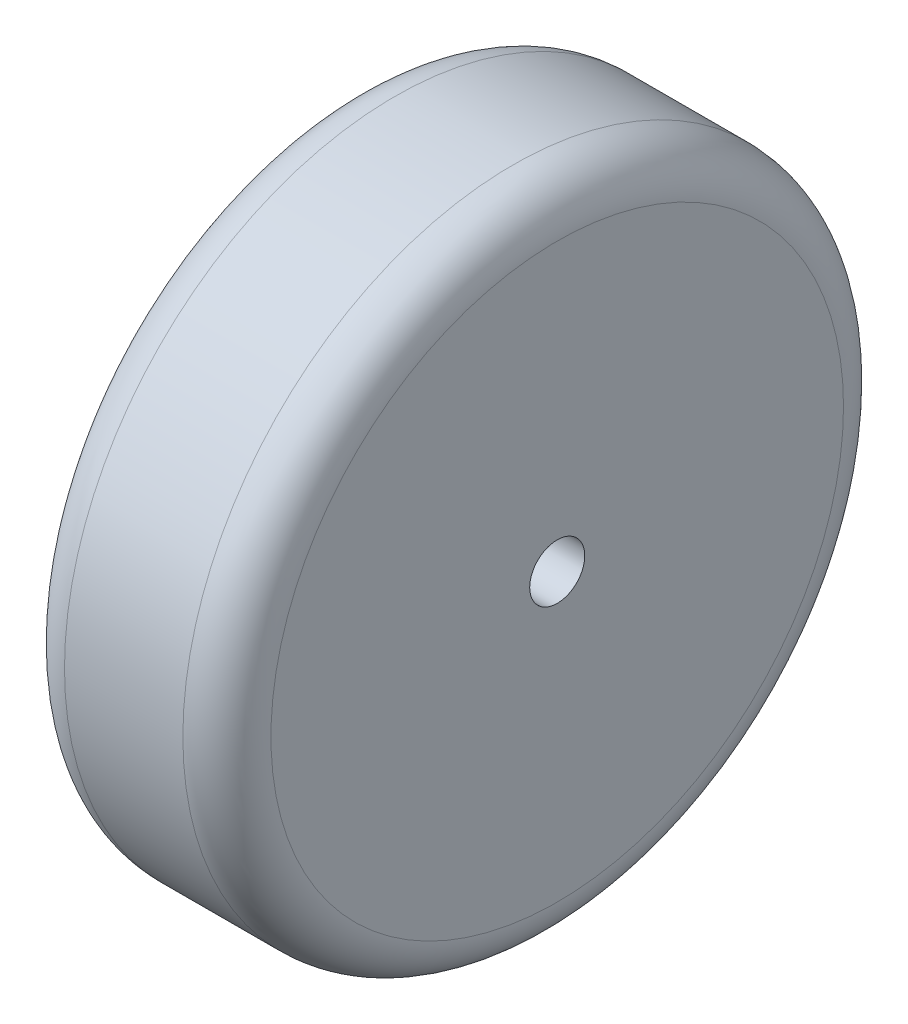
ISO-10303-21;
HEADER;
FILE_DESCRIPTION(('STEP AP214'),'2;1');
FILE_NAME('part.step','',(''),(''),'','','');
FILE_SCHEMA(('AUTOMOTIVE_DESIGN { 1 0 10303 214 1 1 1 1 }'));
ENDSEC;
DATA;
#1=APPLICATION_CONTEXT('core data for automotive mechanical design processes');
#2=APPLICATION_PROTOCOL_DEFINITION('international standard','automotive_design',2000,#1);
#3=PRODUCT_CONTEXT('',#1,'mechanical');
#4=PRODUCT('Part','Part','',(#3));
#5=PRODUCT_RELATED_PRODUCT_CATEGORY('part','',(#4));
#6=PRODUCT_DEFINITION_FORMATION('','',#4);
#7=PRODUCT_DEFINITION_CONTEXT('part definition',#1,'design');
#8=PRODUCT_DEFINITION('design','',#6,#7);
#9=PRODUCT_DEFINITION_SHAPE('','',#8);
#10=(LENGTH_UNIT() NAMED_UNIT(*) SI_UNIT(.MILLI.,.METRE.));
#11=(NAMED_UNIT(*) PLANE_ANGLE_UNIT() SI_UNIT($,.RADIAN.));
#12=(NAMED_UNIT(*) SI_UNIT($,.STERADIAN.) SOLID_ANGLE_UNIT());
#13=UNCERTAINTY_MEASURE_WITH_UNIT(LENGTH_MEASURE(1.E-05),#10,'distance_accuracy_value','');
#14=(GEOMETRIC_REPRESENTATION_CONTEXT(3) GLOBAL_UNCERTAINTY_ASSIGNED_CONTEXT((#13)) GLOBAL_UNIT_ASSIGNED_CONTEXT((#10,
#11,#12)) REPRESENTATION_CONTEXT('',''));
#15=CARTESIAN_POINT('',(0.,0.,0.));
#16=DIRECTION('',(0.,0.,1.));
#17=DIRECTION('',(1.,0.,0.));
#18=AXIS2_PLACEMENT_3D('',#15,#16,#17);
#19=CARTESIAN_POINT('',(11.90625,0.,3.175));
#20=DIRECTION('',(1.,0.,0.));
#21=DIRECTION('',(0.,0.,-1.));
#22=AXIS2_PLACEMENT_3D('',#19,#20,#21);
#23=PLANE('',#22);
#24=CARTESIAN_POINT('',(11.90625,0.,0.));
#25=DIRECTION('',(1.,0.,0.));
#26=DIRECTION('',(0.,0.,-1.));
#27=AXIS2_PLACEMENT_3D('',#24,#25,#26);
#28=CIRCLE('',#27,33.02);
#29=CARTESIAN_POINT('',(11.90625,0.,-33.02));
#30=VERTEX_POINT('',#29);
#31=EDGE_CURVE('E10',#30,#30,#28,.T.);
#32=ORIENTED_EDGE('',*,*,#31,.T.);
#33=EDGE_LOOP('',(#32));
#34=FACE_BOUND('',#33,.T.);
#35=CARTESIAN_POINT('',(11.90625,0.,0.));
#36=DIRECTION('',(-1.,0.,0.));
#37=DIRECTION('',(0.,0.,1.));
#38=AXIS2_PLACEMENT_3D('',#35,#36,#37);
#39=CIRCLE('',#38,3.175);
#40=CARTESIAN_POINT('',(11.90625,0.,3.175));
#41=VERTEX_POINT('',#40);
#42=EDGE_CURVE('E67',#41,#41,#39,.T.);
#43=ORIENTED_EDGE('',*,*,#42,.T.);
#44=EDGE_LOOP('',(#43));
#45=FACE_BOUND('',#44,.T.);
#46=ADVANCED_FACE('F39',(#34,#45),#23,.T.);
#47=CARTESIAN_POINT('',(-11.90625,0.,0.));
#48=DIRECTION('',(-1.,0.,0.));
#49=DIRECTION('',(0.,0.,1.));
#50=AXIS2_PLACEMENT_3D('',#47,#48,#49);
#51=CYLINDRICAL_SURFACE('',#50,38.1);
#52=CARTESIAN_POINT('',(-6.82625,0.,0.));
#53=DIRECTION('',(-1.,0.,0.));
#54=DIRECTION('',(0.,0.,1.));
#55=AXIS2_PLACEMENT_3D('',#52,#53,#54);
#56=CIRCLE('',#55,38.1);
#57=CARTESIAN_POINT('',(-6.82625,0.,38.1));
#58=VERTEX_POINT('',#57);
#59=EDGE_CURVE('E47',#58,#58,#56,.F.);
#60=ORIENTED_EDGE('',*,*,#59,.T.);
#61=EDGE_LOOP('',(#60));
#62=FACE_BOUND('',#61,.T.);
#63=CARTESIAN_POINT('',(6.82625,0.,0.));
#64=DIRECTION('',(1.,0.,0.));
#65=DIRECTION('',(0.,0.,-1.));
#66=AXIS2_PLACEMENT_3D('',#63,#64,#65);
#67=CIRCLE('',#66,38.1);
#68=CARTESIAN_POINT('',(6.82625,0.,-38.1));
#69=VERTEX_POINT('',#68);
#70=EDGE_CURVE('E52',#69,#69,#67,.F.);
#71=ORIENTED_EDGE('',*,*,#70,.T.);
#72=EDGE_LOOP('',(#71));
#73=FACE_BOUND('',#72,.T.);
#74=ADVANCED_FACE('F84',(#62,#73),#51,.T.);
#75=CARTESIAN_POINT('',(-11.90625,0.,38.1));
#76=DIRECTION('',(-1.,0.,0.));
#77=DIRECTION('',(0.,0.,1.));
#78=AXIS2_PLACEMENT_3D('',#75,#76,#77);
#79=PLANE('',#78);
#80=CARTESIAN_POINT('',(-11.90625,0.,0.));
#81=DIRECTION('',(-1.,0.,0.));
#82=DIRECTION('',(0.,0.,1.));
#83=AXIS2_PLACEMENT_3D('',#80,#81,#82);
#84=CIRCLE('',#83,33.02);
#85=CARTESIAN_POINT('',(-11.90625,0.,33.02));
#86=VERTEX_POINT('',#85);
#87=EDGE_CURVE('E57',#86,#86,#84,.T.);
#88=ORIENTED_EDGE('',*,*,#87,.T.);
#89=EDGE_LOOP('',(#88));
#90=FACE_BOUND('',#89,.T.);
#91=CARTESIAN_POINT('',(-11.90625,0.,0.));
#92=DIRECTION('',(-1.,0.,0.));
#93=DIRECTION('',(0.,0.,1.));
#94=AXIS2_PLACEMENT_3D('',#91,#92,#93);
#95=CIRCLE('',#94,3.175);
#96=CARTESIAN_POINT('',(-11.90625,0.,3.175));
#97=VERTEX_POINT('',#96);
#98=EDGE_CURVE('E63',#97,#97,#95,.T.);
#99=ORIENTED_EDGE('',*,*,#98,.F.);
#100=EDGE_LOOP('',(#99));
#101=FACE_BOUND('',#100,.T.);
#102=ADVANCED_FACE('F76',(#90,#101),#79,.T.);
#103=CARTESIAN_POINT('',(-11.90625,0.,0.));
#104=DIRECTION('',(-1.,0.,0.));
#105=DIRECTION('',(0.,0.,1.));
#106=AXIS2_PLACEMENT_3D('',#103,#104,#105);
#107=CYLINDRICAL_SURFACE('',#106,3.175);
#108=ORIENTED_EDGE('',*,*,#98,.T.);
#109=EDGE_LOOP('',(#108));
#110=FACE_BOUND('',#109,.T.);
#111=ORIENTED_EDGE('',*,*,#42,.F.);
#112=EDGE_LOOP('',(#111));
#113=FACE_BOUND('',#112,.T.);
#114=ADVANCED_FACE('F73',(#110,#113),#107,.F.);
#115=CARTESIAN_POINT('',(-6.82625,0.,0.));
#116=DIRECTION('',(-1.,0.,0.));
#117=DIRECTION('',(0.,0.,1.));
#118=AXIS2_PLACEMENT_3D('',#115,#116,#117);
#119=TOROIDAL_SURFACE('',#118,33.02,5.08);
#120=ORIENTED_EDGE('',*,*,#59,.F.);
#121=EDGE_LOOP('',(#120));
#122=FACE_BOUND('',#121,.T.);
#123=ORIENTED_EDGE('',*,*,#87,.F.);
#124=EDGE_LOOP('',(#123));
#125=FACE_BOUND('',#124,.T.);
#126=ADVANCED_FACE('F75',(#122,#125),#119,.T.);
#127=CARTESIAN_POINT('',(6.82625,0.,0.));
#128=DIRECTION('',(1.,0.,0.));
#129=DIRECTION('',(0.,0.,-1.));
#130=AXIS2_PLACEMENT_3D('',#127,#128,#129);
#131=TOROIDAL_SURFACE('',#130,33.02,5.08);
#132=ORIENTED_EDGE('',*,*,#31,.F.);
#133=EDGE_LOOP('',(#132));
#134=FACE_BOUND('',#133,.T.);
#135=ORIENTED_EDGE('',*,*,#70,.F.);
#136=EDGE_LOOP('',(#135));
#137=FACE_BOUND('',#136,.T.);
#138=ADVANCED_FACE('F41',(#134,#137),#131,.T.);
#139=CLOSED_SHELL('',(#46,#74,#102,#114,#126,#138));
#140=MANIFOLD_SOLID_BREP('B2',#139);
#141=ADVANCED_BREP_SHAPE_REPRESENTATION('',(#18,#140),#14);
#142=SHAPE_DEFINITION_REPRESENTATION(#9,#141);
ENDSEC;
END-ISO-10303-21;
